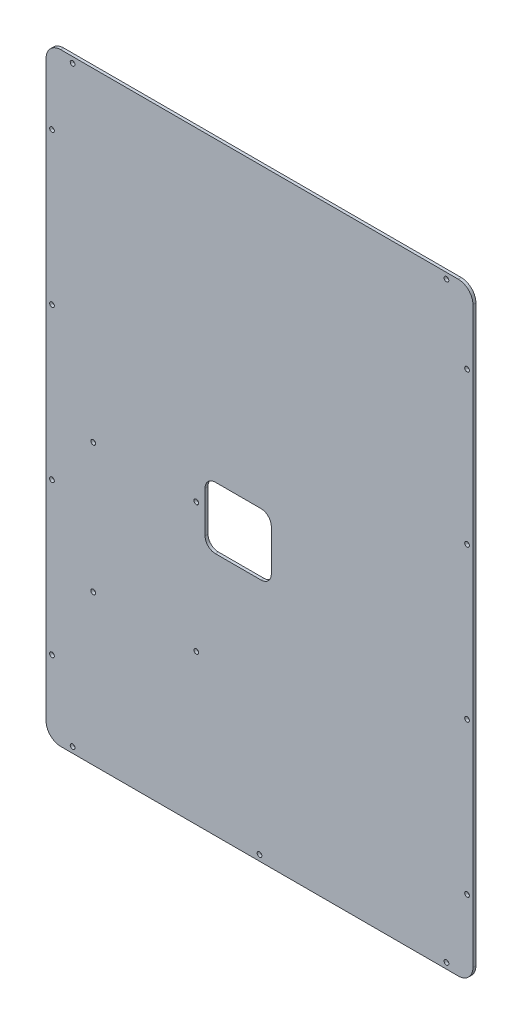
ISO-10303-21;
HEADER;
FILE_DESCRIPTION(('STEP AP214'),'2;1');
FILE_NAME('part.step','',(''),(''),'','','');
FILE_SCHEMA(('AUTOMOTIVE_DESIGN { 1 0 10303 214 1 1 1 1 }'));
ENDSEC;
DATA;
#1=APPLICATION_CONTEXT('core data for automotive mechanical design processes');
#2=APPLICATION_PROTOCOL_DEFINITION('international standard','automotive_design',2000,#1);
#3=PRODUCT_CONTEXT('',#1,'mechanical');
#4=PRODUCT('Part','Part','',(#3));
#5=PRODUCT_RELATED_PRODUCT_CATEGORY('part','',(#4));
#6=PRODUCT_DEFINITION_FORMATION('','',#4);
#7=PRODUCT_DEFINITION_CONTEXT('part definition',#1,'design');
#8=PRODUCT_DEFINITION('design','',#6,#7);
#9=PRODUCT_DEFINITION_SHAPE('','',#8);
#10=(LENGTH_UNIT() NAMED_UNIT(*) SI_UNIT(.MILLI.,.METRE.));
#11=(NAMED_UNIT(*) PLANE_ANGLE_UNIT() SI_UNIT($,.RADIAN.));
#12=(NAMED_UNIT(*) SI_UNIT($,.STERADIAN.) SOLID_ANGLE_UNIT());
#13=UNCERTAINTY_MEASURE_WITH_UNIT(LENGTH_MEASURE(1.E-05),#10,'distance_accuracy_value','');
#14=(GEOMETRIC_REPRESENTATION_CONTEXT(3) GLOBAL_UNCERTAINTY_ASSIGNED_CONTEXT((#13)) GLOBAL_UNIT_ASSIGNED_CONTEXT((#10,
#11,#12)) REPRESENTATION_CONTEXT('',''));
#15=CARTESIAN_POINT('',(0.,0.,0.));
#16=DIRECTION('',(0.,0.,1.));
#17=DIRECTION('',(1.,0.,0.));
#18=AXIS2_PLACEMENT_3D('',#15,#16,#17);
#19=CARTESIAN_POINT('',(-58.9710069601373,-141.789297658863,2.));
#20=DIRECTION('',(0.,0.,-1.));
#21=DIRECTION('',(-1.,0.,0.));
#22=AXIS2_PLACEMENT_3D('',#19,#20,#21);
#23=CYLINDRICAL_SURFACE('',#22,10.);
#24=CARTESIAN_POINT('',(-58.9710069601373,-141.789297658863,0.));
#25=DIRECTION('',(0.,0.,1.));
#26=DIRECTION('',(1.,0.,0.));
#27=AXIS2_PLACEMENT_3D('',#24,#25,#26);
#28=CIRCLE('',#27,10.);
#29=CARTESIAN_POINT('',(-68.9710069601373,-141.789297658863,0.));
#30=VERTEX_POINT('',#29);
#31=CARTESIAN_POINT('',(-58.9710069601372,-151.789297658863,0.));
#32=VERTEX_POINT('',#31);
#33=EDGE_CURVE('E299',#30,#32,#28,.T.);
#34=ORIENTED_EDGE('',*,*,#33,.T.);
#35=DIRECTION('',(0.,0.,-1.));
#36=VECTOR('',#35,1.);
#37=CARTESIAN_POINT('',(-58.9710069601372,-151.789297658863,2.));
#38=LINE('',#37,#36);
#39=CARTESIAN_POINT('',(-58.9710069601372,-151.789297658863,2.));
#40=VERTEX_POINT('',#39);
#41=EDGE_CURVE('E11',#40,#32,#38,.T.);
#42=ORIENTED_EDGE('',*,*,#41,.F.);
#43=CARTESIAN_POINT('',(-58.9710069601373,-141.789297658863,2.));
#44=DIRECTION('',(0.,0.,1.));
#45=DIRECTION('',(1.,0.,0.));
#46=AXIS2_PLACEMENT_3D('',#43,#44,#45);
#47=CIRCLE('',#46,10.);
#48=CARTESIAN_POINT('',(-68.9710069601373,-141.789297658863,2.));
#49=VERTEX_POINT('',#48);
#50=EDGE_CURVE('E302',#49,#40,#47,.T.);
#51=ORIENTED_EDGE('',*,*,#50,.F.);
#52=DIRECTION('',(0.,0.,-1.));
#53=VECTOR('',#52,1.);
#54=CARTESIAN_POINT('',(-68.9710069601373,-141.789297658863,2.));
#55=LINE('',#54,#53);
#56=EDGE_CURVE('E320',#49,#30,#55,.T.);
#57=ORIENTED_EDGE('',*,*,#56,.T.);
#58=EDGE_LOOP('',(#34,#42,#51,#57));
#59=FACE_BOUND('',#58,.T.);
#60=ADVANCED_FACE('F33',(#59),#23,.T.);
#61=CARTESIAN_POINT('',(-58.9710069601372,-151.789297658863,2.));
#62=DIRECTION('',(0.,1.,0.));
#63=DIRECTION('',(0.,0.,1.));
#64=AXIS2_PLACEMENT_3D('',#61,#62,#63);
#65=PLANE('',#64);
#66=DIRECTION('',(1.,0.,0.));
#67=VECTOR('',#66,1.);
#68=CARTESIAN_POINT('',(-58.9710069601372,-151.789297658863,0.));
#69=LINE('',#68,#67);
#70=CARTESIAN_POINT('',(211.028993039863,-151.789297658863,0.));
#71=VERTEX_POINT('',#70);
#72=EDGE_CURVE('E323',#32,#71,#69,.T.);
#73=ORIENTED_EDGE('',*,*,#72,.T.);
#74=DIRECTION('',(0.,0.,-1.));
#75=VECTOR('',#74,1.);
#76=CARTESIAN_POINT('',(211.028993039863,-151.789297658863,2.));
#77=LINE('',#76,#75);
#78=CARTESIAN_POINT('',(211.028993039863,-151.789297658863,2.));
#79=VERTEX_POINT('',#78);
#80=EDGE_CURVE('E40',#79,#71,#77,.T.);
#81=ORIENTED_EDGE('',*,*,#80,.F.);
#82=DIRECTION('',(1.,0.,0.));
#83=VECTOR('',#82,1.);
#84=CARTESIAN_POINT('',(-58.9710069601372,-151.789297658863,2.));
#85=LINE('',#84,#83);
#86=EDGE_CURVE('E305',#40,#79,#85,.T.);
#87=ORIENTED_EDGE('',*,*,#86,.F.);
#88=ORIENTED_EDGE('',*,*,#41,.T.);
#89=EDGE_LOOP('',(#73,#81,#87,#88));
#90=FACE_BOUND('',#89,.T.);
#91=ADVANCED_FACE('F379',(#90),#65,.F.);
#92=CARTESIAN_POINT('',(211.028993039863,-141.789297658863,2.));
#93=DIRECTION('',(0.,0.,-1.));
#94=DIRECTION('',(-1.,0.,0.));
#95=AXIS2_PLACEMENT_3D('',#92,#93,#94);
#96=CYLINDRICAL_SURFACE('',#95,9.99999999999999);
#97=CARTESIAN_POINT('',(211.028993039863,-141.789297658863,0.));
#98=DIRECTION('',(0.,0.,1.));
#99=DIRECTION('',(1.,0.,0.));
#100=AXIS2_PLACEMENT_3D('',#97,#98,#99);
#101=CIRCLE('',#100,9.99999999999999);
#102=CARTESIAN_POINT('',(221.028993039863,-141.789297658863,0.));
#103=VERTEX_POINT('',#102);
#104=EDGE_CURVE('E325',#71,#103,#101,.T.);
#105=ORIENTED_EDGE('',*,*,#104,.T.);
#106=DIRECTION('',(0.,0.,-1.));
#107=VECTOR('',#106,1.);
#108=CARTESIAN_POINT('',(221.028993039863,-141.789297658863,2.));
#109=LINE('',#108,#107);
#110=CARTESIAN_POINT('',(221.028993039863,-141.789297658863,2.));
#111=VERTEX_POINT('',#110);
#112=EDGE_CURVE('E350',#111,#103,#109,.T.);
#113=ORIENTED_EDGE('',*,*,#112,.F.);
#114=CARTESIAN_POINT('',(211.028993039863,-141.789297658863,2.));
#115=DIRECTION('',(0.,0.,1.));
#116=DIRECTION('',(1.,0.,0.));
#117=AXIS2_PLACEMENT_3D('',#114,#115,#116);
#118=CIRCLE('',#117,9.99999999999999);
#119=EDGE_CURVE('E308',#79,#111,#118,.T.);
#120=ORIENTED_EDGE('',*,*,#119,.F.);
#121=ORIENTED_EDGE('',*,*,#80,.T.);
#122=EDGE_LOOP('',(#105,#113,#120,#121));
#123=FACE_BOUND('',#122,.T.);
#124=ADVANCED_FACE('F357',(#123),#96,.T.);
#125=CARTESIAN_POINT('',(221.028993039863,248.210702341137,2.));
#126=DIRECTION('',(-1.,0.,0.));
#127=DIRECTION('',(0.,-1.,0.));
#128=AXIS2_PLACEMENT_3D('',#125,#126,#127);
#129=PLANE('',#128);
#130=DIRECTION('',(0.,1.,0.));
#131=VECTOR('',#130,1.);
#132=CARTESIAN_POINT('',(221.028993039863,248.210702341137,0.));
#133=LINE('',#132,#131);
#134=CARTESIAN_POINT('',(221.028993039863,248.210702341137,0.));
#135=VERTEX_POINT('',#134);
#136=EDGE_CURVE('E327',#103,#135,#133,.T.);
#137=ORIENTED_EDGE('',*,*,#136,.T.);
#138=DIRECTION('',(0.,0.,-1.));
#139=VECTOR('',#138,1.);
#140=CARTESIAN_POINT('',(221.028993039863,248.210702341137,2.));
#141=LINE('',#140,#139);
#142=CARTESIAN_POINT('',(221.028993039863,248.210702341137,2.));
#143=VERTEX_POINT('',#142);
#144=EDGE_CURVE('E347',#143,#135,#141,.T.);
#145=ORIENTED_EDGE('',*,*,#144,.F.);
#146=DIRECTION('',(0.,1.,0.));
#147=VECTOR('',#146,1.);
#148=CARTESIAN_POINT('',(221.028993039863,248.210702341137,2.));
#149=LINE('',#148,#147);
#150=EDGE_CURVE('E310',#111,#143,#149,.T.);
#151=ORIENTED_EDGE('',*,*,#150,.F.);
#152=ORIENTED_EDGE('',*,*,#112,.T.);
#153=EDGE_LOOP('',(#137,#145,#151,#152));
#154=FACE_BOUND('',#153,.T.);
#155=ADVANCED_FACE('F367',(#154),#129,.F.);
#156=CARTESIAN_POINT('',(211.028993039863,248.210702341137,2.));
#157=DIRECTION('',(0.,0.,-1.));
#158=DIRECTION('',(-1.,0.,0.));
#159=AXIS2_PLACEMENT_3D('',#156,#157,#158);
#160=CYLINDRICAL_SURFACE('',#159,9.99999999999999);
#161=CARTESIAN_POINT('',(211.028993039863,248.210702341137,0.));
#162=DIRECTION('',(0.,0.,1.));
#163=DIRECTION('',(-1.,0.,0.));
#164=AXIS2_PLACEMENT_3D('',#161,#162,#163);
#165=CIRCLE('',#164,9.99999999999999);
#166=CARTESIAN_POINT('',(211.028993039863,258.210702341137,0.));
#167=VERTEX_POINT('',#166);
#168=EDGE_CURVE('E329',#135,#167,#165,.T.);
#169=ORIENTED_EDGE('',*,*,#168,.T.);
#170=DIRECTION('',(0.,0.,-1.));
#171=VECTOR('',#170,1.);
#172=CARTESIAN_POINT('',(211.028993039863,258.210702341137,2.));
#173=LINE('',#172,#171);
#174=CARTESIAN_POINT('',(211.028993039863,258.210702341137,2.));
#175=VERTEX_POINT('',#174);
#176=EDGE_CURVE('E344',#175,#167,#173,.T.);
#177=ORIENTED_EDGE('',*,*,#176,.F.);
#178=CARTESIAN_POINT('',(211.028993039863,248.210702341137,2.));
#179=DIRECTION('',(0.,0.,1.));
#180=DIRECTION('',(-1.,0.,0.));
#181=AXIS2_PLACEMENT_3D('',#178,#179,#180);
#182=CIRCLE('',#181,9.99999999999999);
#183=EDGE_CURVE('E312',#143,#175,#182,.T.);
#184=ORIENTED_EDGE('',*,*,#183,.F.);
#185=ORIENTED_EDGE('',*,*,#144,.T.);
#186=EDGE_LOOP('',(#169,#177,#184,#185));
#187=FACE_BOUND('',#186,.T.);
#188=ADVANCED_FACE('F371',(#187),#160,.T.);
#189=CARTESIAN_POINT('',(-58.9710069601373,258.210702341137,2.));
#190=DIRECTION('',(0.,-1.,0.));
#191=DIRECTION('',(0.,0.,-1.));
#192=AXIS2_PLACEMENT_3D('',#189,#190,#191);
#193=PLANE('',#192);
#194=DIRECTION('',(-1.,0.,0.));
#195=VECTOR('',#194,1.);
#196=CARTESIAN_POINT('',(-58.9710069601373,258.210702341137,0.));
#197=LINE('',#196,#195);
#198=CARTESIAN_POINT('',(-58.9710069601373,258.210702341137,0.));
#199=VERTEX_POINT('',#198);
#200=EDGE_CURVE('E331',#167,#199,#197,.T.);
#201=ORIENTED_EDGE('',*,*,#200,.T.);
#202=DIRECTION('',(0.,0.,-1.));
#203=VECTOR('',#202,1.);
#204=CARTESIAN_POINT('',(-58.9710069601373,258.210702341137,2.));
#205=LINE('',#204,#203);
#206=CARTESIAN_POINT('',(-58.9710069601373,258.210702341137,2.));
#207=VERTEX_POINT('',#206);
#208=EDGE_CURVE('E341',#207,#199,#205,.T.);
#209=ORIENTED_EDGE('',*,*,#208,.F.);
#210=DIRECTION('',(-1.,0.,0.));
#211=VECTOR('',#210,1.);
#212=CARTESIAN_POINT('',(-58.9710069601373,258.210702341137,2.));
#213=LINE('',#212,#211);
#214=EDGE_CURVE('E314',#175,#207,#213,.T.);
#215=ORIENTED_EDGE('',*,*,#214,.F.);
#216=ORIENTED_EDGE('',*,*,#176,.T.);
#217=EDGE_LOOP('',(#201,#209,#215,#216));
#218=FACE_BOUND('',#217,.T.);
#219=ADVANCED_FACE('F392',(#218),#193,.F.);
#220=CARTESIAN_POINT('',(-58.9710069601374,248.210702341137,2.));
#221=DIRECTION('',(0.,0.,-1.));
#222=DIRECTION('',(-1.,0.,0.));
#223=AXIS2_PLACEMENT_3D('',#220,#221,#222);
#224=CYLINDRICAL_SURFACE('',#223,10.);
#225=CARTESIAN_POINT('',(-58.9710069601374,248.210702341137,0.));
#226=DIRECTION('',(0.,0.,1.));
#227=DIRECTION('',(1.,0.,0.));
#228=AXIS2_PLACEMENT_3D('',#225,#226,#227);
#229=CIRCLE('',#228,10.);
#230=CARTESIAN_POINT('',(-68.9710069601374,248.210702341137,0.));
#231=VERTEX_POINT('',#230);
#232=EDGE_CURVE('E333',#199,#231,#229,.T.);
#233=ORIENTED_EDGE('',*,*,#232,.T.);
#234=DIRECTION('',(0.,0.,-1.));
#235=VECTOR('',#234,1.);
#236=CARTESIAN_POINT('',(-68.9710069601374,248.210702341137,2.));
#237=LINE('',#236,#235);
#238=CARTESIAN_POINT('',(-68.9710069601374,248.210702341137,2.));
#239=VERTEX_POINT('',#238);
#240=EDGE_CURVE('E338',#239,#231,#237,.T.);
#241=ORIENTED_EDGE('',*,*,#240,.F.);
#242=CARTESIAN_POINT('',(-58.9710069601374,248.210702341137,2.));
#243=DIRECTION('',(0.,0.,1.));
#244=DIRECTION('',(1.,0.,0.));
#245=AXIS2_PLACEMENT_3D('',#242,#243,#244);
#246=CIRCLE('',#245,10.);
#247=EDGE_CURVE('E316',#207,#239,#246,.T.);
#248=ORIENTED_EDGE('',*,*,#247,.F.);
#249=ORIENTED_EDGE('',*,*,#208,.T.);
#250=EDGE_LOOP('',(#233,#241,#248,#249));
#251=FACE_BOUND('',#250,.T.);
#252=ADVANCED_FACE('F390',(#251),#224,.T.);
#253=CARTESIAN_POINT('',(-68.9710069601374,248.210702341137,2.));
#254=DIRECTION('',(1.,0.,0.));
#255=DIRECTION('',(0.,1.,0.));
#256=AXIS2_PLACEMENT_3D('',#253,#254,#255);
#257=PLANE('',#256);
#258=DIRECTION('',(0.,-1.,0.));
#259=VECTOR('',#258,1.);
#260=CARTESIAN_POINT('',(-68.9710069601374,248.210702341137,0.));
#261=LINE('',#260,#259);
#262=EDGE_CURVE('E306',#231,#30,#261,.T.);
#263=ORIENTED_EDGE('',*,*,#262,.T.);
#264=ORIENTED_EDGE('',*,*,#56,.F.);
#265=DIRECTION('',(0.,-1.,0.));
#266=VECTOR('',#265,1.);
#267=CARTESIAN_POINT('',(-68.9710069601374,248.210702341137,2.));
#268=LINE('',#267,#266);
#269=EDGE_CURVE('E318',#239,#49,#268,.T.);
#270=ORIENTED_EDGE('',*,*,#269,.F.);
#271=ORIENTED_EDGE('',*,*,#240,.T.);
#272=EDGE_LOOP('',(#263,#264,#270,#271));
#273=FACE_BOUND('',#272,.T.);
#274=ADVANCED_FACE('F385',(#273),#257,.F.);
#275=CARTESIAN_POINT('',(-58.9710069601373,-141.789297658863,2.));
#276=DIRECTION('',(0.,0.,1.));
#277=DIRECTION('',(1.,0.,0.));
#278=AXIS2_PLACEMENT_3D('',#275,#276,#277);
#279=PLANE('',#278);
#280=CARTESIAN_POINT('',(46.0289930398626,21.2107023411371,2.));
#281=DIRECTION('',(0.,0.,1.));
#282=DIRECTION('',(1.,0.,0.));
#283=AXIS2_PLACEMENT_3D('',#280,#281,#282);
#284=CIRCLE('',#283,6.99999999999999);
#285=CARTESIAN_POINT('',(39.0289930398627,21.2107023411371,2.));
#286=VERTEX_POINT('',#285);
#287=CARTESIAN_POINT('',(46.0289930398626,14.2107023411371,2.));
#288=VERTEX_POINT('',#287);
#289=EDGE_CURVE('E47',#286,#288,#284,.T.);
#290=ORIENTED_EDGE('',*,*,#289,.F.);
#291=DIRECTION('',(0.,-1.,0.));
#292=VECTOR('',#291,1.);
#293=CARTESIAN_POINT('',(39.0289930398626,49.2107023411371,2.));
#294=LINE('',#293,#292);
#295=CARTESIAN_POINT('',(39.0289930398626,49.2107023411371,2.));
#296=VERTEX_POINT('',#295);
#297=EDGE_CURVE('E164',#296,#286,#294,.T.);
#298=ORIENTED_EDGE('',*,*,#297,.F.);
#299=CARTESIAN_POINT('',(46.0289930398626,49.2107023411371,2.));
#300=DIRECTION('',(0.,0.,1.));
#301=DIRECTION('',(1.,0.,0.));
#302=AXIS2_PLACEMENT_3D('',#299,#300,#301);
#303=CIRCLE('',#302,7.);
#304=CARTESIAN_POINT('',(46.0289930398626,56.2107023411371,2.));
#305=VERTEX_POINT('',#304);
#306=EDGE_CURVE('E167',#305,#296,#303,.T.);
#307=ORIENTED_EDGE('',*,*,#306,.F.);
#308=DIRECTION('',(-1.,0.,0.));
#309=VECTOR('',#308,1.);
#310=CARTESIAN_POINT('',(46.0289930398626,56.2107023411371,2.));
#311=LINE('',#310,#309);
#312=CARTESIAN_POINT('',(77.0289930398626,56.2107023411371,2.));
#313=VERTEX_POINT('',#312);
#314=EDGE_CURVE('E198',#313,#305,#311,.T.);
#315=ORIENTED_EDGE('',*,*,#314,.F.);
#316=CARTESIAN_POINT('',(77.0289930398626,49.2107023411371,2.));
#317=DIRECTION('',(0.,0.,1.));
#318=DIRECTION('',(-1.,0.,0.));
#319=AXIS2_PLACEMENT_3D('',#316,#317,#318);
#320=CIRCLE('',#319,7.);
#321=CARTESIAN_POINT('',(84.0289930398626,49.2107023411371,2.));
#322=VERTEX_POINT('',#321);
#323=EDGE_CURVE('E195',#322,#313,#320,.T.);
#324=ORIENTED_EDGE('',*,*,#323,.F.);
#325=DIRECTION('',(0.,1.,0.));
#326=VECTOR('',#325,1.);
#327=CARTESIAN_POINT('',(84.0289930398626,49.2107023411371,2.));
#328=LINE('',#327,#326);
#329=CARTESIAN_POINT('',(84.0289930398626,21.2107023411371,2.));
#330=VERTEX_POINT('',#329);
#331=EDGE_CURVE('E192',#330,#322,#328,.T.);
#332=ORIENTED_EDGE('',*,*,#331,.F.);
#333=CARTESIAN_POINT('',(77.0289930398626,21.2107023411371,2.));
#334=DIRECTION('',(0.,0.,1.));
#335=DIRECTION('',(1.,0.,0.));
#336=AXIS2_PLACEMENT_3D('',#333,#334,#335);
#337=CIRCLE('',#336,7.);
#338=CARTESIAN_POINT('',(77.0289930398626,14.2107023411371,2.));
#339=VERTEX_POINT('',#338);
#340=EDGE_CURVE('E189',#339,#330,#337,.T.);
#341=ORIENTED_EDGE('',*,*,#340,.F.);
#342=DIRECTION('',(1.,0.,0.));
#343=VECTOR('',#342,1.);
#344=CARTESIAN_POINT('',(46.0289930398626,14.2107023411371,2.));
#345=LINE('',#344,#343);
#346=EDGE_CURVE('E187',#288,#339,#345,.T.);
#347=ORIENTED_EDGE('',*,*,#346,.F.);
#348=EDGE_LOOP('',(#290,#298,#307,#315,#324,#332,#341,#347));
#349=FACE_BOUND('',#348,.T.);
#350=CARTESIAN_POINT('',(-36.9710069601374,38.2107023411371,2.));
#351=DIRECTION('',(0.,0.,1.));
#352=DIRECTION('',(1.,0.,0.));
#353=AXIS2_PLACEMENT_3D('',#350,#351,#352);
#354=CIRCLE('',#353,1.60000000000001);
#355=CARTESIAN_POINT('',(-35.3710069601374,38.2107023411371,2.));
#356=VERTEX_POINT('',#355);
#357=EDGE_CURVE('E170',#356,#356,#354,.T.);
#358=ORIENTED_EDGE('',*,*,#357,.F.);
#359=EDGE_LOOP('',(#358));
#360=FACE_BOUND('',#359,.T.);
#361=CARTESIAN_POINT('',(-36.9710069601374,-49.7892976588629,2.));
#362=DIRECTION('',(0.,0.,1.));
#363=DIRECTION('',(1.,0.,0.));
#364=AXIS2_PLACEMENT_3D('',#361,#362,#363);
#365=CIRCLE('',#364,1.60000000000001);
#366=CARTESIAN_POINT('',(-35.3710069601374,-49.7892976588629,2.));
#367=VERTEX_POINT('',#366);
#368=EDGE_CURVE('E720',#367,#367,#365,.T.);
#369=ORIENTED_EDGE('',*,*,#368,.F.);
#370=EDGE_LOOP('',(#369));
#371=FACE_BOUND('',#370,.T.);
#372=CARTESIAN_POINT('',(33.0289930398626,-49.7892976588629,2.));
#373=DIRECTION('',(0.,0.,1.));
#374=DIRECTION('',(1.,0.,0.));
#375=AXIS2_PLACEMENT_3D('',#372,#373,#374);
#376=CIRCLE('',#375,1.60000000000001);
#377=CARTESIAN_POINT('',(34.6289930398626,-49.7892976588629,2.));
#378=VERTEX_POINT('',#377);
#379=EDGE_CURVE('E724',#378,#378,#376,.T.);
#380=ORIENTED_EDGE('',*,*,#379,.F.);
#381=EDGE_LOOP('',(#380));
#382=FACE_BOUND('',#381,.T.);
#383=CARTESIAN_POINT('',(33.0289930398626,38.2107023411371,2.));
#384=DIRECTION('',(0.,0.,1.));
#385=DIRECTION('',(1.,0.,0.));
#386=AXIS2_PLACEMENT_3D('',#383,#384,#385);
#387=CIRCLE('',#386,1.6);
#388=CARTESIAN_POINT('',(34.6289930398626,38.2107023411371,2.));
#389=VERTEX_POINT('',#388);
#390=EDGE_CURVE('E220',#389,#389,#387,.T.);
#391=ORIENTED_EDGE('',*,*,#390,.F.);
#392=EDGE_LOOP('',(#391));
#393=FACE_BOUND('',#392,.T.);
#394=CARTESIAN_POINT('',(217.02899303987,-100.789297658863,2.));
#395=DIRECTION('',(0.,0.,1.));
#396=DIRECTION('',(1.,0.,0.));
#397=AXIS2_PLACEMENT_3D('',#394,#395,#396);
#398=CIRCLE('',#397,1.59999999999999);
#399=CARTESIAN_POINT('',(218.62899303987,-100.789297658863,2.));
#400=VERTEX_POINT('',#399);
#401=EDGE_CURVE('E239',#400,#400,#398,.T.);
#402=ORIENTED_EDGE('',*,*,#401,.F.);
#403=EDGE_LOOP('',(#402));
#404=FACE_BOUND('',#403,.T.);
#405=CARTESIAN_POINT('',(217.028993039868,2.2107023411371,2.));
#406=DIRECTION('',(0.,0.,1.));
#407=DIRECTION('',(1.,0.,0.));
#408=AXIS2_PLACEMENT_3D('',#405,#406,#407);
#409=CIRCLE('',#408,1.59999999999999);
#410=CARTESIAN_POINT('',(218.628993039868,2.2107023411371,2.));
#411=VERTEX_POINT('',#410);
#412=EDGE_CURVE('E264',#411,#411,#409,.T.);
#413=ORIENTED_EDGE('',*,*,#412,.F.);
#414=EDGE_LOOP('',(#413));
#415=FACE_BOUND('',#414,.T.);
#416=CARTESIAN_POINT('',(217.028993039865,105.210702341137,2.));
#417=DIRECTION('',(0.,0.,1.));
#418=DIRECTION('',(1.,0.,0.));
#419=AXIS2_PLACEMENT_3D('',#416,#417,#418);
#420=CIRCLE('',#419,1.59999999999999);
#421=CARTESIAN_POINT('',(218.628993039865,105.210702341137,2.));
#422=VERTEX_POINT('',#421);
#423=EDGE_CURVE('E258',#422,#422,#420,.T.);
#424=ORIENTED_EDGE('',*,*,#423,.F.);
#425=EDGE_LOOP('',(#424));
#426=FACE_BOUND('',#425,.T.);
#427=CARTESIAN_POINT('',(-50.9710069601373,254.210702341137,2.));
#428=DIRECTION('',(0.,0.,1.));
#429=DIRECTION('',(1.,0.,0.));
#430=AXIS2_PLACEMENT_3D('',#427,#428,#429);
#431=CIRCLE('',#430,1.59999999999999);
#432=CARTESIAN_POINT('',(-49.3710069601374,254.210702341137,2.));
#433=VERTEX_POINT('',#432);
#434=EDGE_CURVE('E252',#433,#433,#431,.T.);
#435=ORIENTED_EDGE('',*,*,#434,.F.);
#436=EDGE_LOOP('',(#435));
#437=FACE_BOUND('',#436,.T.);
#438=CARTESIAN_POINT('',(-64.971006960121,-100.789297658863,2.));
#439=DIRECTION('',(0.,0.,1.));
#440=DIRECTION('',(1.,0.,0.));
#441=AXIS2_PLACEMENT_3D('',#438,#439,#440);
#442=CIRCLE('',#441,1.59999999999999);
#443=CARTESIAN_POINT('',(-63.371006960121,-100.789297658863,2.));
#444=VERTEX_POINT('',#443);
#445=EDGE_CURVE('E251',#444,#444,#442,.T.);
#446=ORIENTED_EDGE('',*,*,#445,.F.);
#447=EDGE_LOOP('',(#446));
#448=FACE_BOUND('',#447,.T.);
#449=CARTESIAN_POINT('',(-64.9710069601264,2.2107023411371,2.));
#450=DIRECTION('',(0.,0.,1.));
#451=DIRECTION('',(1.,0.,0.));
#452=AXIS2_PLACEMENT_3D('',#449,#450,#451);
#453=CIRCLE('',#452,1.59999999999999);
#454=CARTESIAN_POINT('',(-63.3710069601264,2.2107023411371,2.));
#455=VERTEX_POINT('',#454);
#456=EDGE_CURVE('E288',#455,#455,#453,.T.);
#457=ORIENTED_EDGE('',*,*,#456,.F.);
#458=EDGE_LOOP('',(#457));
#459=FACE_BOUND('',#458,.T.);
#460=CARTESIAN_POINT('',(-64.9710069601319,105.210702341137,2.));
#461=DIRECTION('',(0.,0.,1.));
#462=DIRECTION('',(1.,0.,0.));
#463=AXIS2_PLACEMENT_3D('',#460,#461,#462);
#464=CIRCLE('',#463,1.59999999999999);
#465=CARTESIAN_POINT('',(-63.3710069601319,105.210702341137,2.));
#466=VERTEX_POINT('',#465);
#467=EDGE_CURVE('E282',#466,#466,#464,.T.);
#468=ORIENTED_EDGE('',*,*,#467,.F.);
#469=EDGE_LOOP('',(#468));
#470=FACE_BOUND('',#469,.T.);
#471=CARTESIAN_POINT('',(217.028993039863,208.210702341137,2.));
#472=DIRECTION('',(0.,0.,1.));
#473=DIRECTION('',(1.,0.,0.));
#474=AXIS2_PLACEMENT_3D('',#471,#472,#473);
#475=CIRCLE('',#474,1.59999999999999);
#476=CARTESIAN_POINT('',(218.628993039863,208.210702341137,2.));
#477=VERTEX_POINT('',#476);
#478=EDGE_CURVE('E276',#477,#477,#475,.T.);
#479=ORIENTED_EDGE('',*,*,#478,.F.);
#480=EDGE_LOOP('',(#479));
#481=FACE_BOUND('',#480,.T.);
#482=CARTESIAN_POINT('',(203.028993039863,-147.789297658863,2.));
#483=DIRECTION('',(0.,0.,1.));
#484=DIRECTION('',(1.,0.,0.));
#485=AXIS2_PLACEMENT_3D('',#482,#483,#484);
#486=CIRCLE('',#485,1.59999999999999);
#487=CARTESIAN_POINT('',(204.628993039863,-147.789297658863,2.));
#488=VERTEX_POINT('',#487);
#489=EDGE_CURVE('E219',#488,#488,#486,.T.);
#490=ORIENTED_EDGE('',*,*,#489,.F.);
#491=EDGE_LOOP('',(#490));
#492=FACE_BOUND('',#491,.T.);
#493=CARTESIAN_POINT('',(76.0289930398627,-147.789297658863,2.));
#494=DIRECTION('',(0.,0.,1.));
#495=DIRECTION('',(1.,0.,0.));
#496=AXIS2_PLACEMENT_3D('',#493,#494,#495);
#497=CIRCLE('',#496,1.59999999999999);
#498=CARTESIAN_POINT('',(77.6289930398626,-147.789297658863,2.));
#499=VERTEX_POINT('',#498);
#500=EDGE_CURVE('E228',#499,#499,#497,.T.);
#501=ORIENTED_EDGE('',*,*,#500,.F.);
#502=EDGE_LOOP('',(#501));
#503=FACE_BOUND('',#502,.T.);
#504=CARTESIAN_POINT('',(-50.9710069601373,-147.789297658863,2.));
#505=DIRECTION('',(0.,0.,1.));
#506=DIRECTION('',(1.,0.,0.));
#507=AXIS2_PLACEMENT_3D('',#504,#505,#506);
#508=CIRCLE('',#507,1.59999999999999);
#509=CARTESIAN_POINT('',(-49.3710069601374,-147.789297658863,2.));
#510=VERTEX_POINT('',#509);
#511=EDGE_CURVE('E227',#510,#510,#508,.T.);
#512=ORIENTED_EDGE('',*,*,#511,.F.);
#513=EDGE_LOOP('',(#512));
#514=FACE_BOUND('',#513,.T.);
#515=CARTESIAN_POINT('',(203.028993039863,254.210702341137,2.));
#516=DIRECTION('',(0.,0.,1.));
#517=DIRECTION('',(1.,0.,0.));
#518=AXIS2_PLACEMENT_3D('',#515,#516,#517);
#519=CIRCLE('',#518,1.59999999999999);
#520=CARTESIAN_POINT('',(204.628993039863,254.210702341137,2.));
#521=VERTEX_POINT('',#520);
#522=EDGE_CURVE('E240',#521,#521,#519,.T.);
#523=ORIENTED_EDGE('',*,*,#522,.F.);
#524=EDGE_LOOP('',(#523));
#525=FACE_BOUND('',#524,.T.);
#526=CARTESIAN_POINT('',(-64.9710069601374,208.210702341137,2.));
#527=DIRECTION('',(0.,0.,1.));
#528=DIRECTION('',(1.,0.,0.));
#529=AXIS2_PLACEMENT_3D('',#526,#527,#528);
#530=CIRCLE('',#529,1.59999999999999);
#531=CARTESIAN_POINT('',(-63.3710069601374,208.210702341137,2.));
#532=VERTEX_POINT('',#531);
#533=EDGE_CURVE('E275',#532,#532,#530,.T.);
#534=ORIENTED_EDGE('',*,*,#533,.F.);
#535=EDGE_LOOP('',(#534));
#536=FACE_BOUND('',#535,.T.);
#537=ORIENTED_EDGE('',*,*,#50,.T.);
#538=ORIENTED_EDGE('',*,*,#86,.T.);
#539=ORIENTED_EDGE('',*,*,#119,.T.);
#540=ORIENTED_EDGE('',*,*,#150,.T.);
#541=ORIENTED_EDGE('',*,*,#183,.T.);
#542=ORIENTED_EDGE('',*,*,#214,.T.);
#543=ORIENTED_EDGE('',*,*,#247,.T.);
#544=ORIENTED_EDGE('',*,*,#269,.T.);
#545=EDGE_LOOP('',(#537,#538,#539,#540,#541,#542,#543,#544));
#546=FACE_BOUND('',#545,.T.);
#547=ADVANCED_FACE('F375',(#349,#360,#371,#382,#393,#404,#415,#426,#437,#448,#459,#470,#481,
#492,#503,#514,#525,#536,#546),#279,.T.);
#548=CARTESIAN_POINT('',(-58.9710069601373,-141.789297658863,0.));
#549=DIRECTION('',(0.,0.,1.));
#550=DIRECTION('',(1.,0.,0.));
#551=AXIS2_PLACEMENT_3D('',#548,#549,#550);
#552=PLANE('',#551);
#553=DIRECTION('',(0.,-1.,0.));
#554=VECTOR('',#553,1.);
#555=CARTESIAN_POINT('',(39.0289930398626,49.2107023411371,0.));
#556=LINE('',#555,#554);
#557=CARTESIAN_POINT('',(39.0289930398626,49.2107023411371,0.));
#558=VERTEX_POINT('',#557);
#559=CARTESIAN_POINT('',(39.0289930398627,21.2107023411371,0.));
#560=VERTEX_POINT('',#559);
#561=EDGE_CURVE('E153',#558,#560,#556,.T.);
#562=ORIENTED_EDGE('',*,*,#561,.T.);
#563=CARTESIAN_POINT('',(46.0289930398626,21.2107023411371,0.));
#564=DIRECTION('',(0.,0.,1.));
#565=DIRECTION('',(1.,0.,0.));
#566=AXIS2_PLACEMENT_3D('',#563,#564,#565);
#567=CIRCLE('',#566,6.99999999999999);
#568=CARTESIAN_POINT('',(46.0289930398626,14.2107023411371,0.));
#569=VERTEX_POINT('',#568);
#570=EDGE_CURVE('E147',#560,#569,#567,.T.);
#571=ORIENTED_EDGE('',*,*,#570,.T.);
#572=DIRECTION('',(1.,0.,0.));
#573=VECTOR('',#572,1.);
#574=CARTESIAN_POINT('',(46.0289930398626,14.2107023411371,0.));
#575=LINE('',#574,#573);
#576=CARTESIAN_POINT('',(77.0289930398626,14.2107023411371,0.));
#577=VERTEX_POINT('',#576);
#578=EDGE_CURVE('E156',#569,#577,#575,.T.);
#579=ORIENTED_EDGE('',*,*,#578,.T.);
#580=CARTESIAN_POINT('',(77.0289930398626,21.2107023411371,0.));
#581=DIRECTION('',(0.,0.,1.));
#582=DIRECTION('',(1.,0.,0.));
#583=AXIS2_PLACEMENT_3D('',#580,#581,#582);
#584=CIRCLE('',#583,7.);
#585=CARTESIAN_POINT('',(84.0289930398626,21.2107023411371,0.));
#586=VERTEX_POINT('',#585);
#587=EDGE_CURVE('E55',#577,#586,#584,.T.);
#588=ORIENTED_EDGE('',*,*,#587,.T.);
#589=DIRECTION('',(0.,1.,0.));
#590=VECTOR('',#589,1.);
#591=CARTESIAN_POINT('',(84.0289930398626,49.2107023411371,0.));
#592=LINE('',#591,#590);
#593=CARTESIAN_POINT('',(84.0289930398626,49.2107023411371,0.));
#594=VERTEX_POINT('',#593);
#595=EDGE_CURVE('E174',#586,#594,#592,.T.);
#596=ORIENTED_EDGE('',*,*,#595,.T.);
#597=CARTESIAN_POINT('',(77.0289930398626,49.2107023411371,0.));
#598=DIRECTION('',(0.,0.,1.));
#599=DIRECTION('',(-1.,0.,0.));
#600=AXIS2_PLACEMENT_3D('',#597,#598,#599);
#601=CIRCLE('',#600,7.);
#602=CARTESIAN_POINT('',(77.0289930398626,56.2107023411371,0.));
#603=VERTEX_POINT('',#602);
#604=EDGE_CURVE('E177',#594,#603,#601,.T.);
#605=ORIENTED_EDGE('',*,*,#604,.T.);
#606=DIRECTION('',(-1.,0.,0.));
#607=VECTOR('',#606,1.);
#608=CARTESIAN_POINT('',(46.0289930398626,56.2107023411371,0.));
#609=LINE('',#608,#607);
#610=CARTESIAN_POINT('',(46.0289930398626,56.2107023411371,0.));
#611=VERTEX_POINT('',#610);
#612=EDGE_CURVE('E180',#603,#611,#609,.T.);
#613=ORIENTED_EDGE('',*,*,#612,.T.);
#614=CARTESIAN_POINT('',(46.0289930398626,49.2107023411371,0.));
#615=DIRECTION('',(0.,0.,1.));
#616=DIRECTION('',(1.,0.,0.));
#617=AXIS2_PLACEMENT_3D('',#614,#615,#616);
#618=CIRCLE('',#617,7.);
#619=EDGE_CURVE('E183',#611,#558,#618,.T.);
#620=ORIENTED_EDGE('',*,*,#619,.T.);
#621=EDGE_LOOP('',(#562,#571,#579,#588,#596,#605,#613,#620));
#622=FACE_BOUND('',#621,.T.);
#623=CARTESIAN_POINT('',(-36.9710069601374,38.2107023411371,0.));
#624=DIRECTION('',(0.,0.,1.));
#625=DIRECTION('',(1.,0.,0.));
#626=AXIS2_PLACEMENT_3D('',#623,#624,#625);
#627=CIRCLE('',#626,1.60000000000001);
#628=CARTESIAN_POINT('',(-35.3710069601374,38.2107023411371,0.));
#629=VERTEX_POINT('',#628);
#630=EDGE_CURVE('E774',#629,#629,#627,.T.);
#631=ORIENTED_EDGE('',*,*,#630,.T.);
#632=EDGE_LOOP('',(#631));
#633=FACE_BOUND('',#632,.T.);
#634=CARTESIAN_POINT('',(-36.9710069601374,-49.7892976588629,0.));
#635=DIRECTION('',(0.,0.,1.));
#636=DIRECTION('',(1.,0.,0.));
#637=AXIS2_PLACEMENT_3D('',#634,#635,#636);
#638=CIRCLE('',#637,1.60000000000001);
#639=CARTESIAN_POINT('',(-35.3710069601374,-49.7892976588629,0.));
#640=VERTEX_POINT('',#639);
#641=EDGE_CURVE('E767',#640,#640,#638,.T.);
#642=ORIENTED_EDGE('',*,*,#641,.T.);
#643=EDGE_LOOP('',(#642));
#644=FACE_BOUND('',#643,.T.);
#645=CARTESIAN_POINT('',(33.0289930398626,-49.7892976588629,0.));
#646=DIRECTION('',(0.,0.,1.));
#647=DIRECTION('',(1.,0.,0.));
#648=AXIS2_PLACEMENT_3D('',#645,#646,#647);
#649=CIRCLE('',#648,1.60000000000001);
#650=CARTESIAN_POINT('',(34.6289930398626,-49.7892976588629,0.));
#651=VERTEX_POINT('',#650);
#652=EDGE_CURVE('E223',#651,#651,#649,.T.);
#653=ORIENTED_EDGE('',*,*,#652,.T.);
#654=EDGE_LOOP('',(#653));
#655=FACE_BOUND('',#654,.T.);
#656=CARTESIAN_POINT('',(33.0289930398626,38.2107023411371,0.));
#657=DIRECTION('',(0.,0.,1.));
#658=DIRECTION('',(1.,0.,0.));
#659=AXIS2_PLACEMENT_3D('',#656,#657,#658);
#660=CIRCLE('',#659,1.6);
#661=CARTESIAN_POINT('',(34.6289930398626,38.2107023411371,0.));
#662=VERTEX_POINT('',#661);
#663=EDGE_CURVE('E216',#662,#662,#660,.T.);
#664=ORIENTED_EDGE('',*,*,#663,.T.);
#665=EDGE_LOOP('',(#664));
#666=FACE_BOUND('',#665,.T.);
#667=CARTESIAN_POINT('',(217.02899303987,-100.789297658863,0.));
#668=DIRECTION('',(0.,0.,1.));
#669=DIRECTION('',(1.,0.,0.));
#670=AXIS2_PLACEMENT_3D('',#667,#668,#669);
#671=CIRCLE('',#670,1.59999999999999);
#672=CARTESIAN_POINT('',(218.62899303987,-100.789297658863,0.));
#673=VERTEX_POINT('',#672);
#674=EDGE_CURVE('E267',#673,#673,#671,.T.);
#675=ORIENTED_EDGE('',*,*,#674,.T.);
#676=EDGE_LOOP('',(#675));
#677=FACE_BOUND('',#676,.T.);
#678=CARTESIAN_POINT('',(217.028993039868,2.2107023411371,0.));
#679=DIRECTION('',(0.,0.,1.));
#680=DIRECTION('',(1.,0.,0.));
#681=AXIS2_PLACEMENT_3D('',#678,#679,#680);
#682=CIRCLE('',#681,1.59999999999999);
#683=CARTESIAN_POINT('',(218.628993039868,2.2107023411371,0.));
#684=VERTEX_POINT('',#683);
#685=EDGE_CURVE('E261',#684,#684,#682,.T.);
#686=ORIENTED_EDGE('',*,*,#685,.T.);
#687=EDGE_LOOP('',(#686));
#688=FACE_BOUND('',#687,.T.);
#689=CARTESIAN_POINT('',(217.028993039865,105.210702341137,0.));
#690=DIRECTION('',(0.,0.,1.));
#691=DIRECTION('',(1.,0.,0.));
#692=AXIS2_PLACEMENT_3D('',#689,#690,#691);
#693=CIRCLE('',#692,1.59999999999999);
#694=CARTESIAN_POINT('',(218.628993039865,105.210702341137,0.));
#695=VERTEX_POINT('',#694);
#696=EDGE_CURVE('E255',#695,#695,#693,.T.);
#697=ORIENTED_EDGE('',*,*,#696,.T.);
#698=EDGE_LOOP('',(#697));
#699=FACE_BOUND('',#698,.T.);
#700=CARTESIAN_POINT('',(-50.9710069601373,254.210702341137,0.));
#701=DIRECTION('',(0.,0.,1.));
#702=DIRECTION('',(1.,0.,0.));
#703=AXIS2_PLACEMENT_3D('',#700,#701,#702);
#704=CIRCLE('',#703,1.59999999999999);
#705=CARTESIAN_POINT('',(-49.3710069601374,254.210702341137,0.));
#706=VERTEX_POINT('',#705);
#707=EDGE_CURVE('E248',#706,#706,#704,.T.);
#708=ORIENTED_EDGE('',*,*,#707,.T.);
#709=EDGE_LOOP('',(#708));
#710=FACE_BOUND('',#709,.T.);
#711=CARTESIAN_POINT('',(-64.971006960121,-100.789297658863,0.));
#712=DIRECTION('',(0.,0.,1.));
#713=DIRECTION('',(1.,0.,0.));
#714=AXIS2_PLACEMENT_3D('',#711,#712,#713);
#715=CIRCLE('',#714,1.59999999999999);
#716=CARTESIAN_POINT('',(-63.371006960121,-100.789297658863,0.));
#717=VERTEX_POINT('',#716);
#718=EDGE_CURVE('E291',#717,#717,#715,.T.);
#719=ORIENTED_EDGE('',*,*,#718,.T.);
#720=EDGE_LOOP('',(#719));
#721=FACE_BOUND('',#720,.T.);
#722=CARTESIAN_POINT('',(-64.9710069601264,2.2107023411371,0.));
#723=DIRECTION('',(0.,0.,1.));
#724=DIRECTION('',(1.,0.,0.));
#725=AXIS2_PLACEMENT_3D('',#722,#723,#724);
#726=CIRCLE('',#725,1.59999999999999);
#727=CARTESIAN_POINT('',(-63.3710069601264,2.2107023411371,0.));
#728=VERTEX_POINT('',#727);
#729=EDGE_CURVE('E285',#728,#728,#726,.T.);
#730=ORIENTED_EDGE('',*,*,#729,.T.);
#731=EDGE_LOOP('',(#730));
#732=FACE_BOUND('',#731,.T.);
#733=CARTESIAN_POINT('',(-64.9710069601319,105.210702341137,0.));
#734=DIRECTION('',(0.,0.,1.));
#735=DIRECTION('',(1.,0.,0.));
#736=AXIS2_PLACEMENT_3D('',#733,#734,#735);
#737=CIRCLE('',#736,1.59999999999999);
#738=CARTESIAN_POINT('',(-63.3710069601319,105.210702341137,0.));
#739=VERTEX_POINT('',#738);
#740=EDGE_CURVE('E279',#739,#739,#737,.T.);
#741=ORIENTED_EDGE('',*,*,#740,.T.);
#742=EDGE_LOOP('',(#741));
#743=FACE_BOUND('',#742,.T.);
#744=CARTESIAN_POINT('',(217.028993039863,208.210702341137,0.));
#745=DIRECTION('',(0.,0.,1.));
#746=DIRECTION('',(1.,0.,0.));
#747=AXIS2_PLACEMENT_3D('',#744,#745,#746);
#748=CIRCLE('',#747,1.59999999999999);
#749=CARTESIAN_POINT('',(218.628993039863,208.210702341137,0.));
#750=VERTEX_POINT('',#749);
#751=EDGE_CURVE('E272',#750,#750,#748,.T.);
#752=ORIENTED_EDGE('',*,*,#751,.T.);
#753=EDGE_LOOP('',(#752));
#754=FACE_BOUND('',#753,.T.);
#755=CARTESIAN_POINT('',(203.028993039863,-147.789297658863,0.));
#756=DIRECTION('',(0.,0.,1.));
#757=DIRECTION('',(1.,0.,0.));
#758=AXIS2_PLACEMENT_3D('',#755,#756,#757);
#759=CIRCLE('',#758,1.59999999999999);
#760=CARTESIAN_POINT('',(204.628993039863,-147.789297658863,0.));
#761=VERTEX_POINT('',#760);
#762=EDGE_CURVE('E231',#761,#761,#759,.T.);
#763=ORIENTED_EDGE('',*,*,#762,.T.);
#764=EDGE_LOOP('',(#763));
#765=FACE_BOUND('',#764,.T.);
#766=CARTESIAN_POINT('',(76.0289930398627,-147.789297658863,0.));
#767=DIRECTION('',(0.,0.,1.));
#768=DIRECTION('',(1.,0.,0.));
#769=AXIS2_PLACEMENT_3D('',#766,#767,#768);
#770=CIRCLE('',#769,1.59999999999999);
#771=CARTESIAN_POINT('',(77.6289930398626,-147.789297658863,0.));
#772=VERTEX_POINT('',#771);
#773=EDGE_CURVE('E224',#772,#772,#770,.T.);
#774=ORIENTED_EDGE('',*,*,#773,.T.);
#775=EDGE_LOOP('',(#774));
#776=FACE_BOUND('',#775,.T.);
#777=CARTESIAN_POINT('',(-50.9710069601373,-147.789297658863,0.));
#778=DIRECTION('',(0.,0.,1.));
#779=DIRECTION('',(1.,0.,0.));
#780=AXIS2_PLACEMENT_3D('',#777,#778,#779);
#781=CIRCLE('',#780,1.59999999999999);
#782=CARTESIAN_POINT('',(-49.3710069601374,-147.789297658863,0.));
#783=VERTEX_POINT('',#782);
#784=EDGE_CURVE('E243',#783,#783,#781,.T.);
#785=ORIENTED_EDGE('',*,*,#784,.T.);
#786=EDGE_LOOP('',(#785));
#787=FACE_BOUND('',#786,.T.);
#788=CARTESIAN_POINT('',(203.028993039863,254.210702341137,0.));
#789=DIRECTION('',(0.,0.,1.));
#790=DIRECTION('',(1.,0.,0.));
#791=AXIS2_PLACEMENT_3D('',#788,#789,#790);
#792=CIRCLE('',#791,1.59999999999999);
#793=CARTESIAN_POINT('',(204.628993039863,254.210702341137,0.));
#794=VERTEX_POINT('',#793);
#795=EDGE_CURVE('E236',#794,#794,#792,.T.);
#796=ORIENTED_EDGE('',*,*,#795,.T.);
#797=EDGE_LOOP('',(#796));
#798=FACE_BOUND('',#797,.T.);
#799=CARTESIAN_POINT('',(-64.9710069601374,208.210702341137,0.));
#800=DIRECTION('',(0.,0.,1.));
#801=DIRECTION('',(1.,0.,0.));
#802=AXIS2_PLACEMENT_3D('',#799,#800,#801);
#803=CIRCLE('',#802,1.59999999999999);
#804=CARTESIAN_POINT('',(-63.3710069601374,208.210702341137,0.));
#805=VERTEX_POINT('',#804);
#806=EDGE_CURVE('E296',#805,#805,#803,.T.);
#807=ORIENTED_EDGE('',*,*,#806,.T.);
#808=EDGE_LOOP('',(#807));
#809=FACE_BOUND('',#808,.T.);
#810=ORIENTED_EDGE('',*,*,#33,.F.);
#811=ORIENTED_EDGE('',*,*,#262,.F.);
#812=ORIENTED_EDGE('',*,*,#232,.F.);
#813=ORIENTED_EDGE('',*,*,#200,.F.);
#814=ORIENTED_EDGE('',*,*,#168,.F.);
#815=ORIENTED_EDGE('',*,*,#136,.F.);
#816=ORIENTED_EDGE('',*,*,#104,.F.);
#817=ORIENTED_EDGE('',*,*,#72,.F.);
#818=EDGE_LOOP('',(#810,#811,#812,#813,#814,#815,#816,#817));
#819=FACE_BOUND('',#818,.T.);
#820=ADVANCED_FACE('F160',(#622,#633,#644,#655,#666,#677,#688,#699,#710,#721,#732,#743,#754,
#765,#776,#787,#798,#809,#819),#552,.F.);
#821=CARTESIAN_POINT('',(-64.9710069601374,208.210702341137,0.));
#822=DIRECTION('',(0.,0.,1.));
#823=DIRECTION('',(1.,0.,0.));
#824=AXIS2_PLACEMENT_3D('',#821,#822,#823);
#825=CYLINDRICAL_SURFACE('',#824,1.59999999999999);
#826=ORIENTED_EDGE('',*,*,#806,.F.);
#827=EDGE_LOOP('',(#826));
#828=FACE_BOUND('',#827,.T.);
#829=ORIENTED_EDGE('',*,*,#533,.T.);
#830=EDGE_LOOP('',(#829));
#831=FACE_BOUND('',#830,.T.);
#832=ADVANCED_FACE('F444',(#828,#831),#825,.F.);
#833=CARTESIAN_POINT('',(203.028993039863,254.210702341137,0.));
#834=DIRECTION('',(0.,0.,1.));
#835=DIRECTION('',(1.,0.,0.));
#836=AXIS2_PLACEMENT_3D('',#833,#834,#835);
#837=CYLINDRICAL_SURFACE('',#836,1.59999999999999);
#838=ORIENTED_EDGE('',*,*,#795,.F.);
#839=EDGE_LOOP('',(#838));
#840=FACE_BOUND('',#839,.T.);
#841=ORIENTED_EDGE('',*,*,#522,.T.);
#842=EDGE_LOOP('',(#841));
#843=FACE_BOUND('',#842,.T.);
#844=ADVANCED_FACE('F449',(#840,#843),#837,.F.);
#845=CARTESIAN_POINT('',(-50.9710069601373,-147.789297658863,0.));
#846=DIRECTION('',(0.,0.,1.));
#847=DIRECTION('',(1.,0.,0.));
#848=AXIS2_PLACEMENT_3D('',#845,#846,#847);
#849=CYLINDRICAL_SURFACE('',#848,1.59999999999999);
#850=ORIENTED_EDGE('',*,*,#784,.F.);
#851=EDGE_LOOP('',(#850));
#852=FACE_BOUND('',#851,.T.);
#853=ORIENTED_EDGE('',*,*,#511,.T.);
#854=EDGE_LOOP('',(#853));
#855=FACE_BOUND('',#854,.T.);
#856=ADVANCED_FACE('F461',(#852,#855),#849,.F.);
#857=CARTESIAN_POINT('',(76.0289930398627,-147.789297658863,0.));
#858=DIRECTION('',(0.,0.,1.));
#859=DIRECTION('',(1.,0.,0.));
#860=AXIS2_PLACEMENT_3D('',#857,#858,#859);
#861=CYLINDRICAL_SURFACE('',#860,1.59999999999999);
#862=ORIENTED_EDGE('',*,*,#773,.F.);
#863=EDGE_LOOP('',(#862));
#864=FACE_BOUND('',#863,.T.);
#865=ORIENTED_EDGE('',*,*,#500,.T.);
#866=EDGE_LOOP('',(#865));
#867=FACE_BOUND('',#866,.T.);
#868=ADVANCED_FACE('F471',(#864,#867),#861,.F.);
#869=CARTESIAN_POINT('',(203.028993039863,-147.789297658863,0.));
#870=DIRECTION('',(0.,0.,1.));
#871=DIRECTION('',(1.,0.,0.));
#872=AXIS2_PLACEMENT_3D('',#869,#870,#871);
#873=CYLINDRICAL_SURFACE('',#872,1.59999999999999);
#874=ORIENTED_EDGE('',*,*,#762,.F.);
#875=EDGE_LOOP('',(#874));
#876=FACE_BOUND('',#875,.T.);
#877=ORIENTED_EDGE('',*,*,#489,.T.);
#878=EDGE_LOOP('',(#877));
#879=FACE_BOUND('',#878,.T.);
#880=ADVANCED_FACE('F481',(#876,#879),#873,.F.);
#881=CARTESIAN_POINT('',(217.028993039863,208.210702341137,0.));
#882=DIRECTION('',(0.,0.,1.));
#883=DIRECTION('',(1.,0.,0.));
#884=AXIS2_PLACEMENT_3D('',#881,#882,#883);
#885=CYLINDRICAL_SURFACE('',#884,1.59999999999999);
#886=ORIENTED_EDGE('',*,*,#751,.F.);
#887=EDGE_LOOP('',(#886));
#888=FACE_BOUND('',#887,.T.);
#889=ORIENTED_EDGE('',*,*,#478,.T.);
#890=EDGE_LOOP('',(#889));
#891=FACE_BOUND('',#890,.T.);
#892=ADVANCED_FACE('F491',(#888,#891),#885,.F.);
#893=CARTESIAN_POINT('',(-64.9710069601319,105.210702341137,0.));
#894=DIRECTION('',(0.,0.,1.));
#895=DIRECTION('',(1.,0.,0.));
#896=AXIS2_PLACEMENT_3D('',#893,#894,#895);
#897=CYLINDRICAL_SURFACE('',#896,1.59999999999999);
#898=ORIENTED_EDGE('',*,*,#740,.F.);
#899=EDGE_LOOP('',(#898));
#900=FACE_BOUND('',#899,.T.);
#901=ORIENTED_EDGE('',*,*,#467,.T.);
#902=EDGE_LOOP('',(#901));
#903=FACE_BOUND('',#902,.T.);
#904=ADVANCED_FACE('F501',(#900,#903),#897,.F.);
#905=CARTESIAN_POINT('',(-64.9710069601264,2.2107023411371,0.));
#906=DIRECTION('',(0.,0.,1.));
#907=DIRECTION('',(1.,0.,0.));
#908=AXIS2_PLACEMENT_3D('',#905,#906,#907);
#909=CYLINDRICAL_SURFACE('',#908,1.59999999999999);
#910=ORIENTED_EDGE('',*,*,#729,.F.);
#911=EDGE_LOOP('',(#910));
#912=FACE_BOUND('',#911,.T.);
#913=ORIENTED_EDGE('',*,*,#456,.T.);
#914=EDGE_LOOP('',(#913));
#915=FACE_BOUND('',#914,.T.);
#916=ADVANCED_FACE('F511',(#912,#915),#909,.F.);
#917=CARTESIAN_POINT('',(-64.971006960121,-100.789297658863,0.));
#918=DIRECTION('',(0.,0.,1.));
#919=DIRECTION('',(1.,0.,0.));
#920=AXIS2_PLACEMENT_3D('',#917,#918,#919);
#921=CYLINDRICAL_SURFACE('',#920,1.59999999999999);
#922=ORIENTED_EDGE('',*,*,#718,.F.);
#923=EDGE_LOOP('',(#922));
#924=FACE_BOUND('',#923,.T.);
#925=ORIENTED_EDGE('',*,*,#445,.T.);
#926=EDGE_LOOP('',(#925));
#927=FACE_BOUND('',#926,.T.);
#928=ADVANCED_FACE('F521',(#924,#927),#921,.F.);
#929=CARTESIAN_POINT('',(-50.9710069601373,254.210702341137,0.));
#930=DIRECTION('',(0.,0.,1.));
#931=DIRECTION('',(1.,0.,0.));
#932=AXIS2_PLACEMENT_3D('',#929,#930,#931);
#933=CYLINDRICAL_SURFACE('',#932,1.59999999999999);
#934=ORIENTED_EDGE('',*,*,#707,.F.);
#935=EDGE_LOOP('',(#934));
#936=FACE_BOUND('',#935,.T.);
#937=ORIENTED_EDGE('',*,*,#434,.T.);
#938=EDGE_LOOP('',(#937));
#939=FACE_BOUND('',#938,.T.);
#940=ADVANCED_FACE('F531',(#936,#939),#933,.F.);
#941=CARTESIAN_POINT('',(217.028993039865,105.210702341137,0.));
#942=DIRECTION('',(0.,0.,1.));
#943=DIRECTION('',(1.,0.,0.));
#944=AXIS2_PLACEMENT_3D('',#941,#942,#943);
#945=CYLINDRICAL_SURFACE('',#944,1.59999999999999);
#946=ORIENTED_EDGE('',*,*,#696,.F.);
#947=EDGE_LOOP('',(#946));
#948=FACE_BOUND('',#947,.T.);
#949=ORIENTED_EDGE('',*,*,#423,.T.);
#950=EDGE_LOOP('',(#949));
#951=FACE_BOUND('',#950,.T.);
#952=ADVANCED_FACE('F541',(#948,#951),#945,.F.);
#953=CARTESIAN_POINT('',(217.028993039868,2.2107023411371,0.));
#954=DIRECTION('',(0.,0.,1.));
#955=DIRECTION('',(1.,0.,0.));
#956=AXIS2_PLACEMENT_3D('',#953,#954,#955);
#957=CYLINDRICAL_SURFACE('',#956,1.59999999999999);
#958=ORIENTED_EDGE('',*,*,#685,.F.);
#959=EDGE_LOOP('',(#958));
#960=FACE_BOUND('',#959,.T.);
#961=ORIENTED_EDGE('',*,*,#412,.T.);
#962=EDGE_LOOP('',(#961));
#963=FACE_BOUND('',#962,.T.);
#964=ADVANCED_FACE('F551',(#960,#963),#957,.F.);
#965=CARTESIAN_POINT('',(217.02899303987,-100.789297658863,0.));
#966=DIRECTION('',(0.,0.,1.));
#967=DIRECTION('',(1.,0.,0.));
#968=AXIS2_PLACEMENT_3D('',#965,#966,#967);
#969=CYLINDRICAL_SURFACE('',#968,1.59999999999999);
#970=ORIENTED_EDGE('',*,*,#674,.F.);
#971=EDGE_LOOP('',(#970));
#972=FACE_BOUND('',#971,.T.);
#973=ORIENTED_EDGE('',*,*,#401,.T.);
#974=EDGE_LOOP('',(#973));
#975=FACE_BOUND('',#974,.T.);
#976=ADVANCED_FACE('F561',(#972,#975),#969,.F.);
#977=CARTESIAN_POINT('',(33.0289930398626,38.2107023411371,0.));
#978=DIRECTION('',(0.,0.,1.));
#979=DIRECTION('',(1.,0.,0.));
#980=AXIS2_PLACEMENT_3D('',#977,#978,#979);
#981=CYLINDRICAL_SURFACE('',#980,1.6);
#982=ORIENTED_EDGE('',*,*,#663,.F.);
#983=EDGE_LOOP('',(#982));
#984=FACE_BOUND('',#983,.T.);
#985=ORIENTED_EDGE('',*,*,#390,.T.);
#986=EDGE_LOOP('',(#985));
#987=FACE_BOUND('',#986,.T.);
#988=ADVANCED_FACE('F571',(#984,#987),#981,.F.);
#989=CARTESIAN_POINT('',(33.0289930398626,-49.7892976588629,0.));
#990=DIRECTION('',(0.,0.,1.));
#991=DIRECTION('',(1.,0.,0.));
#992=AXIS2_PLACEMENT_3D('',#989,#990,#991);
#993=CYLINDRICAL_SURFACE('',#992,1.60000000000001);
#994=ORIENTED_EDGE('',*,*,#652,.F.);
#995=EDGE_LOOP('',(#994));
#996=FACE_BOUND('',#995,.T.);
#997=ORIENTED_EDGE('',*,*,#379,.T.);
#998=EDGE_LOOP('',(#997));
#999=FACE_BOUND('',#998,.T.);
#1000=ADVANCED_FACE('F594',(#996,#999),#993,.F.);
#1001=CARTESIAN_POINT('',(-36.9710069601374,-49.7892976588629,0.));
#1002=DIRECTION('',(0.,0.,1.));
#1003=DIRECTION('',(1.,0.,0.));
#1004=AXIS2_PLACEMENT_3D('',#1001,#1002,#1003);
#1005=CYLINDRICAL_SURFACE('',#1004,1.60000000000001);
#1006=ORIENTED_EDGE('',*,*,#641,.F.);
#1007=EDGE_LOOP('',(#1006));
#1008=FACE_BOUND('',#1007,.T.);
#1009=ORIENTED_EDGE('',*,*,#368,.T.);
#1010=EDGE_LOOP('',(#1009));
#1011=FACE_BOUND('',#1010,.T.);
#1012=ADVANCED_FACE('F604',(#1008,#1011),#1005,.F.);
#1013=CARTESIAN_POINT('',(-36.9710069601374,38.2107023411371,0.));
#1014=DIRECTION('',(0.,0.,1.));
#1015=DIRECTION('',(1.,0.,0.));
#1016=AXIS2_PLACEMENT_3D('',#1013,#1014,#1015);
#1017=CYLINDRICAL_SURFACE('',#1016,1.60000000000001);
#1018=ORIENTED_EDGE('',*,*,#630,.F.);
#1019=EDGE_LOOP('',(#1018));
#1020=FACE_BOUND('',#1019,.T.);
#1021=ORIENTED_EDGE('',*,*,#357,.T.);
#1022=EDGE_LOOP('',(#1021));
#1023=FACE_BOUND('',#1022,.T.);
#1024=ADVANCED_FACE('F614',(#1020,#1023),#1017,.F.);
#1025=CARTESIAN_POINT('',(46.0289930398626,21.2107023411371,0.));
#1026=DIRECTION('',(0.,0.,1.));
#1027=DIRECTION('',(1.,0.,0.));
#1028=AXIS2_PLACEMENT_3D('',#1025,#1026,#1027);
#1029=CYLINDRICAL_SURFACE('',#1028,6.99999999999999);
#1030=ORIENTED_EDGE('',*,*,#289,.T.);
#1031=DIRECTION('',(0.,0.,1.));
#1032=VECTOR('',#1031,1.);
#1033=CARTESIAN_POINT('',(46.0289930398626,14.2107023411371,0.));
#1034=LINE('',#1033,#1032);
#1035=EDGE_CURVE('E143',#569,#288,#1034,.T.);
#1036=ORIENTED_EDGE('',*,*,#1035,.F.);
#1037=ORIENTED_EDGE('',*,*,#570,.F.);
#1038=DIRECTION('',(0.,0.,1.));
#1039=VECTOR('',#1038,1.);
#1040=CARTESIAN_POINT('',(39.0289930398627,21.2107023411371,0.));
#1041=LINE('',#1040,#1039);
#1042=EDGE_CURVE('E203',#560,#286,#1041,.T.);
#1043=ORIENTED_EDGE('',*,*,#1042,.T.);
#1044=EDGE_LOOP('',(#1030,#1036,#1037,#1043));
#1045=FACE_BOUND('',#1044,.T.);
#1046=ADVANCED_FACE('F145',(#1045),#1029,.F.);
#1047=CARTESIAN_POINT('',(39.0289930398626,49.2107023411371,0.));
#1048=DIRECTION('',(-1.,0.,0.));
#1049=DIRECTION('',(0.,-1.,0.));
#1050=AXIS2_PLACEMENT_3D('',#1047,#1048,#1049);
#1051=PLANE('',#1050);
#1052=ORIENTED_EDGE('',*,*,#297,.T.);
#1053=ORIENTED_EDGE('',*,*,#1042,.F.);
#1054=ORIENTED_EDGE('',*,*,#561,.F.);
#1055=DIRECTION('',(0.,0.,1.));
#1056=VECTOR('',#1055,1.);
#1057=CARTESIAN_POINT('',(39.0289930398626,49.2107023411371,0.));
#1058=LINE('',#1057,#1056);
#1059=EDGE_CURVE('E205',#558,#296,#1058,.T.);
#1060=ORIENTED_EDGE('',*,*,#1059,.T.);
#1061=EDGE_LOOP('',(#1052,#1053,#1054,#1060));
#1062=FACE_BOUND('',#1061,.T.);
#1063=ADVANCED_FACE('F633',(#1062),#1051,.F.);
#1064=CARTESIAN_POINT('',(46.0289930398626,49.2107023411371,0.));
#1065=DIRECTION('',(0.,0.,1.));
#1066=DIRECTION('',(1.,0.,0.));
#1067=AXIS2_PLACEMENT_3D('',#1064,#1065,#1066);
#1068=CYLINDRICAL_SURFACE('',#1067,7.);
#1069=ORIENTED_EDGE('',*,*,#306,.T.);
#1070=ORIENTED_EDGE('',*,*,#1059,.F.);
#1071=ORIENTED_EDGE('',*,*,#619,.F.);
#1072=DIRECTION('',(0.,0.,1.));
#1073=VECTOR('',#1072,1.);
#1074=CARTESIAN_POINT('',(46.0289930398626,56.2107023411371,0.));
#1075=LINE('',#1074,#1073);
#1076=EDGE_CURVE('E207',#611,#305,#1075,.T.);
#1077=ORIENTED_EDGE('',*,*,#1076,.T.);
#1078=EDGE_LOOP('',(#1069,#1070,#1071,#1077));
#1079=FACE_BOUND('',#1078,.T.);
#1080=ADVANCED_FACE('F642',(#1079),#1068,.F.);
#1081=CARTESIAN_POINT('',(46.0289930398626,56.2107023411371,0.));
#1082=DIRECTION('',(0.,1.,0.));
#1083=DIRECTION('',(-1.,0.,0.));
#1084=AXIS2_PLACEMENT_3D('',#1081,#1082,#1083);
#1085=PLANE('',#1084);
#1086=ORIENTED_EDGE('',*,*,#314,.T.);
#1087=ORIENTED_EDGE('',*,*,#1076,.F.);
#1088=ORIENTED_EDGE('',*,*,#612,.F.);
#1089=DIRECTION('',(0.,0.,1.));
#1090=VECTOR('',#1089,1.);
#1091=CARTESIAN_POINT('',(77.0289930398626,56.2107023411371,0.));
#1092=LINE('',#1091,#1090);
#1093=EDGE_CURVE('E209',#603,#313,#1092,.T.);
#1094=ORIENTED_EDGE('',*,*,#1093,.T.);
#1095=EDGE_LOOP('',(#1086,#1087,#1088,#1094));
#1096=FACE_BOUND('',#1095,.T.);
#1097=ADVANCED_FACE('F652',(#1096),#1085,.F.);
#1098=CARTESIAN_POINT('',(77.0289930398626,49.2107023411371,0.));
#1099=DIRECTION('',(0.,0.,1.));
#1100=DIRECTION('',(1.,0.,0.));
#1101=AXIS2_PLACEMENT_3D('',#1098,#1099,#1100);
#1102=CYLINDRICAL_SURFACE('',#1101,7.);
#1103=ORIENTED_EDGE('',*,*,#323,.T.);
#1104=ORIENTED_EDGE('',*,*,#1093,.F.);
#1105=ORIENTED_EDGE('',*,*,#604,.F.);
#1106=DIRECTION('',(0.,0.,1.));
#1107=VECTOR('',#1106,1.);
#1108=CARTESIAN_POINT('',(84.0289930398626,49.2107023411371,0.));
#1109=LINE('',#1108,#1107);
#1110=EDGE_CURVE('E211',#594,#322,#1109,.T.);
#1111=ORIENTED_EDGE('',*,*,#1110,.T.);
#1112=EDGE_LOOP('',(#1103,#1104,#1105,#1111));
#1113=FACE_BOUND('',#1112,.T.);
#1114=ADVANCED_FACE('F662',(#1113),#1102,.F.);
#1115=CARTESIAN_POINT('',(84.0289930398626,49.2107023411371,0.));
#1116=DIRECTION('',(1.,0.,0.));
#1117=DIRECTION('',(0.,0.,-1.));
#1118=AXIS2_PLACEMENT_3D('',#1115,#1116,#1117);
#1119=PLANE('',#1118);
#1120=ORIENTED_EDGE('',*,*,#331,.T.);
#1121=ORIENTED_EDGE('',*,*,#1110,.F.);
#1122=ORIENTED_EDGE('',*,*,#595,.F.);
#1123=DIRECTION('',(0.,0.,1.));
#1124=VECTOR('',#1123,1.);
#1125=CARTESIAN_POINT('',(84.0289930398626,21.2107023411371,0.));
#1126=LINE('',#1125,#1124);
#1127=EDGE_CURVE('E213',#586,#330,#1126,.T.);
#1128=ORIENTED_EDGE('',*,*,#1127,.T.);
#1129=EDGE_LOOP('',(#1120,#1121,#1122,#1128));
#1130=FACE_BOUND('',#1129,.T.);
#1131=ADVANCED_FACE('F672',(#1130),#1119,.F.);
#1132=CARTESIAN_POINT('',(77.0289930398626,21.2107023411371,0.));
#1133=DIRECTION('',(0.,0.,1.));
#1134=DIRECTION('',(1.,0.,0.));
#1135=AXIS2_PLACEMENT_3D('',#1132,#1133,#1134);
#1136=CYLINDRICAL_SURFACE('',#1135,7.);
#1137=ORIENTED_EDGE('',*,*,#340,.T.);
#1138=ORIENTED_EDGE('',*,*,#1127,.F.);
#1139=ORIENTED_EDGE('',*,*,#587,.F.);
#1140=DIRECTION('',(0.,0.,1.));
#1141=VECTOR('',#1140,1.);
#1142=CARTESIAN_POINT('',(77.0289930398626,14.2107023411371,0.));
#1143=LINE('',#1142,#1141);
#1144=EDGE_CURVE('E152',#577,#339,#1143,.T.);
#1145=ORIENTED_EDGE('',*,*,#1144,.T.);
#1146=EDGE_LOOP('',(#1137,#1138,#1139,#1145));
#1147=FACE_BOUND('',#1146,.T.);
#1148=ADVANCED_FACE('F682',(#1147),#1136,.F.);
#1149=CARTESIAN_POINT('',(46.0289930398626,14.2107023411371,0.));
#1150=DIRECTION('',(0.,-1.,0.));
#1151=DIRECTION('',(1.,0.,0.));
#1152=AXIS2_PLACEMENT_3D('',#1149,#1150,#1151);
#1153=PLANE('',#1152);
#1154=ORIENTED_EDGE('',*,*,#346,.T.);
#1155=ORIENTED_EDGE('',*,*,#1144,.F.);
#1156=ORIENTED_EDGE('',*,*,#578,.F.);
#1157=ORIENTED_EDGE('',*,*,#1035,.T.);
#1158=EDGE_LOOP('',(#1154,#1155,#1156,#1157));
#1159=FACE_BOUND('',#1158,.T.);
#1160=ADVANCED_FACE('F157',(#1159),#1153,.F.);
#1161=CLOSED_SHELL('',(#60,#91,#124,#155,#188,#219,#252,#274,#547,#820,#832,#844,#856,#868,#880,
#892,#904,#916,#928,#940,#952,#964,#976,#988,#1000,#1012,#1024,#1046,#1063,#1080,#1097,#1114,
#1131,#1148,#1160));
#1162=MANIFOLD_SOLID_BREP('B2',#1161);
#1163=ADVANCED_BREP_SHAPE_REPRESENTATION('',(#18,#1162),#14);
#1164=SHAPE_DEFINITION_REPRESENTATION(#9,#1163);
ENDSEC;
END-ISO-10303-21;
